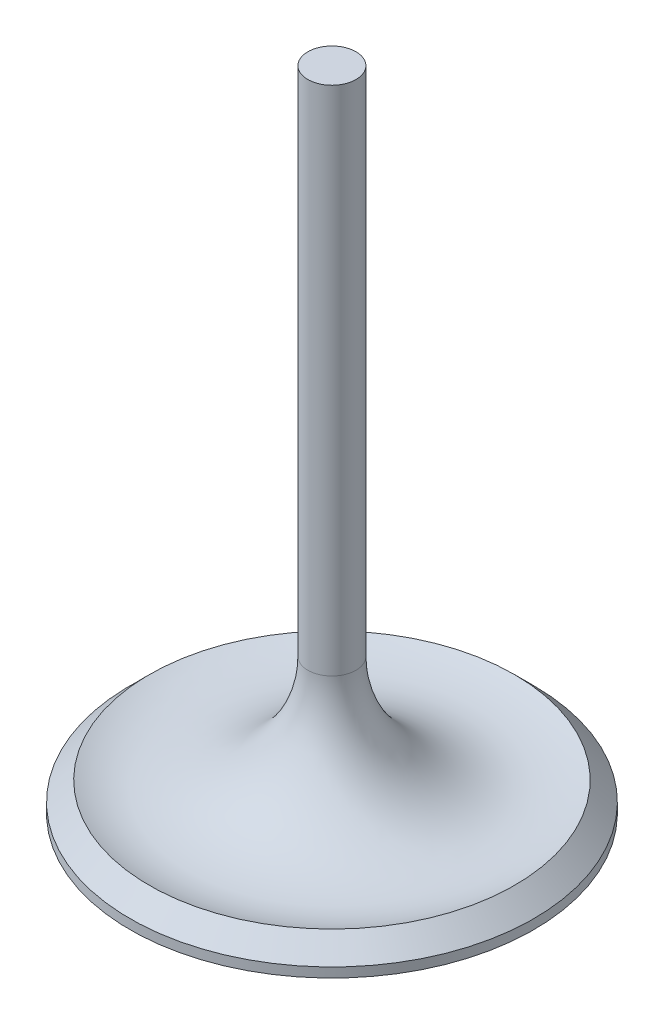
ISO-10303-21;
HEADER;
FILE_DESCRIPTION(('STEP AP214'),'2;1');
FILE_NAME('part.step','',(''),(''),'','','');
FILE_SCHEMA(('AUTOMOTIVE_DESIGN { 1 0 10303 214 1 1 1 1 }'));
ENDSEC;
DATA;
#1=APPLICATION_CONTEXT('core data for automotive mechanical design processes');
#2=APPLICATION_PROTOCOL_DEFINITION('international standard','automotive_design',2000,#1);
#3=PRODUCT_CONTEXT('',#1,'mechanical');
#4=PRODUCT('Part','Part','',(#3));
#5=PRODUCT_RELATED_PRODUCT_CATEGORY('part','',(#4));
#6=PRODUCT_DEFINITION_FORMATION('','',#4);
#7=PRODUCT_DEFINITION_CONTEXT('part definition',#1,'design');
#8=PRODUCT_DEFINITION('design','',#6,#7);
#9=PRODUCT_DEFINITION_SHAPE('','',#8);
#10=(LENGTH_UNIT() NAMED_UNIT(*) SI_UNIT(.MILLI.,.METRE.));
#11=(NAMED_UNIT(*) PLANE_ANGLE_UNIT() SI_UNIT($,.RADIAN.));
#12=(NAMED_UNIT(*) SI_UNIT($,.STERADIAN.) SOLID_ANGLE_UNIT());
#13=UNCERTAINTY_MEASURE_WITH_UNIT(LENGTH_MEASURE(1.E-05),#10,'distance_accuracy_value','');
#14=(GEOMETRIC_REPRESENTATION_CONTEXT(3) GLOBAL_UNCERTAINTY_ASSIGNED_CONTEXT((#13)) GLOBAL_UNIT_ASSIGNED_CONTEXT((#10,
#11,#12)) REPRESENTATION_CONTEXT('',''));
#15=CARTESIAN_POINT('',(0.,0.,0.));
#16=DIRECTION('',(0.,0.,1.));
#17=DIRECTION('',(1.,0.,0.));
#18=AXIS2_PLACEMENT_3D('',#15,#16,#17);
#19=CARTESIAN_POINT('',(0.,0.,0.));
#20=DIRECTION('',(0.,-1.,0.));
#21=DIRECTION('',(0.,0.,-1.));
#22=AXIS2_PLACEMENT_3D('',#19,#20,#21);
#23=PLANE('',#22);
#24=CARTESIAN_POINT('',(0.,0.,0.));
#25=DIRECTION('',(0.,-1.,0.));
#26=DIRECTION('',(0.,0.,-1.));
#27=AXIS2_PLACEMENT_3D('',#24,#25,#26);
#28=CIRCLE('',#27,26.67);
#29=CARTESIAN_POINT('',(0.,0.,-26.67));
#30=VERTEX_POINT('',#29);
#31=EDGE_CURVE('E10',#30,#30,#28,.T.);
#32=ORIENTED_EDGE('',*,*,#31,.T.);
#33=EDGE_LOOP('',(#32));
#34=FACE_BOUND('',#33,.T.);
#35=ADVANCED_FACE('F40',(#34),#23,.T.);
#36=CARTESIAN_POINT('',(0.,0.,0.));
#37=DIRECTION('',(0.,-1.,0.));
#38=DIRECTION('',(0.,0.,-1.));
#39=AXIS2_PLACEMENT_3D('',#36,#37,#38);
#40=CYLINDRICAL_SURFACE('',#39,26.67);
#41=CARTESIAN_POINT('',(0.,1.27,0.));
#42=DIRECTION('',(0.,-1.,0.));
#43=DIRECTION('',(0.,0.,-1.));
#44=AXIS2_PLACEMENT_3D('',#41,#42,#43);
#45=CIRCLE('',#44,26.67);
#46=CARTESIAN_POINT('',(0.,1.27,-26.67));
#47=VERTEX_POINT('',#46);
#48=EDGE_CURVE('E47',#47,#47,#45,.T.);
#49=ORIENTED_EDGE('',*,*,#48,.T.);
#50=EDGE_LOOP('',(#49));
#51=FACE_BOUND('',#50,.T.);
#52=ORIENTED_EDGE('',*,*,#31,.F.);
#53=EDGE_LOOP('',(#52));
#54=FACE_BOUND('',#53,.T.);
#55=ADVANCED_FACE('F80',(#51,#54),#40,.T.);
#56=CARTESIAN_POINT('',(0.,1.27,0.));
#57=DIRECTION('',(0.,-1.,0.));
#58=DIRECTION('',(0.,0.,-1.));
#59=AXIS2_PLACEMENT_3D('',#56,#57,#58);
#60=CONICAL_SURFACE('',#59,26.67,0.785398163397457);
#61=CARTESIAN_POINT('',(0.,3.80999999999999,0.));
#62=DIRECTION('',(0.,-1.,0.));
#63=DIRECTION('',(0.,0.,-1.));
#64=AXIS2_PLACEMENT_3D('',#61,#62,#63);
#65=CIRCLE('',#64,24.13);
#66=CARTESIAN_POINT('',(0.,3.80999999999999,-24.13));
#67=VERTEX_POINT('',#66);
#68=EDGE_CURVE('E52',#67,#67,#65,.T.);
#69=ORIENTED_EDGE('',*,*,#68,.T.);
#70=EDGE_LOOP('',(#69));
#71=FACE_BOUND('',#70,.T.);
#72=ORIENTED_EDGE('',*,*,#48,.F.);
#73=EDGE_LOOP('',(#72));
#74=FACE_BOUND('',#73,.T.);
#75=ADVANCED_FACE('F84',(#71,#74),#60,.T.);
#76=CARTESIAN_POINT('',(0.,17.9546986535592,0.));
#77=DIRECTION('',(0.,-1.,0.));
#78=DIRECTION('',(0.,0.,-1.));
#79=AXIS2_PLACEMENT_3D('',#76,#77,#78);
#80=TOROIDAL_SURFACE('',#79,18.43,15.25);
#81=CARTESIAN_POINT('',(0.,17.9546986535592,0.));
#82=DIRECTION('',(0.,-1.,0.));
#83=DIRECTION('',(0.,0.,-1.));
#84=AXIS2_PLACEMENT_3D('',#81,#82,#83);
#85=CIRCLE('',#84,3.18000000000001);
#86=CARTESIAN_POINT('',(0.,17.9546986535592,-3.18000000000001));
#87=VERTEX_POINT('',#86);
#88=EDGE_CURVE('E57',#87,#87,#85,.T.);
#89=ORIENTED_EDGE('',*,*,#88,.T.);
#90=EDGE_LOOP('',(#89));
#91=FACE_BOUND('',#90,.T.);
#92=ORIENTED_EDGE('',*,*,#68,.F.);
#93=EDGE_LOOP('',(#92));
#94=FACE_BOUND('',#93,.T.);
#95=ADVANCED_FACE('F77',(#91,#94),#80,.F.);
#96=CARTESIAN_POINT('',(0.,0.,0.));
#97=DIRECTION('',(0.,-1.,0.));
#98=DIRECTION('',(0.,0.,-1.));
#99=AXIS2_PLACEMENT_3D('',#96,#97,#98);
#100=CYLINDRICAL_SURFACE('',#99,3.18);
#101=CARTESIAN_POINT('',(0.,85.55,0.));
#102=DIRECTION('',(0.,-1.,0.));
#103=DIRECTION('',(0.,0.,-1.));
#104=AXIS2_PLACEMENT_3D('',#101,#102,#103);
#105=CIRCLE('',#104,3.18);
#106=CARTESIAN_POINT('',(0.,85.55,-3.18));
#107=VERTEX_POINT('',#106);
#108=EDGE_CURVE('E63',#107,#107,#105,.T.);
#109=ORIENTED_EDGE('',*,*,#108,.T.);
#110=EDGE_LOOP('',(#109));
#111=FACE_BOUND('',#110,.T.);
#112=ORIENTED_EDGE('',*,*,#88,.F.);
#113=EDGE_LOOP('',(#112));
#114=FACE_BOUND('',#113,.T.);
#115=ADVANCED_FACE('F68',(#111,#114),#100,.T.);
#116=CARTESIAN_POINT('',(0.,85.55,0.));
#117=DIRECTION('',(0.,1.,0.));
#118=DIRECTION('',(0.,0.,1.));
#119=AXIS2_PLACEMENT_3D('',#116,#117,#118);
#120=PLANE('',#119);
#121=ORIENTED_EDGE('',*,*,#108,.F.);
#122=EDGE_LOOP('',(#121));
#123=FACE_BOUND('',#122,.T.);
#124=ADVANCED_FACE('F71',(#123),#120,.T.);
#125=CLOSED_SHELL('',(#35,#55,#75,#95,#115,#124));
#126=MANIFOLD_SOLID_BREP('B2',#125);
#127=ADVANCED_BREP_SHAPE_REPRESENTATION('',(#18,#126),#14);
#128=SHAPE_DEFINITION_REPRESENTATION(#9,#127);
ENDSEC;
END-ISO-10303-21;
